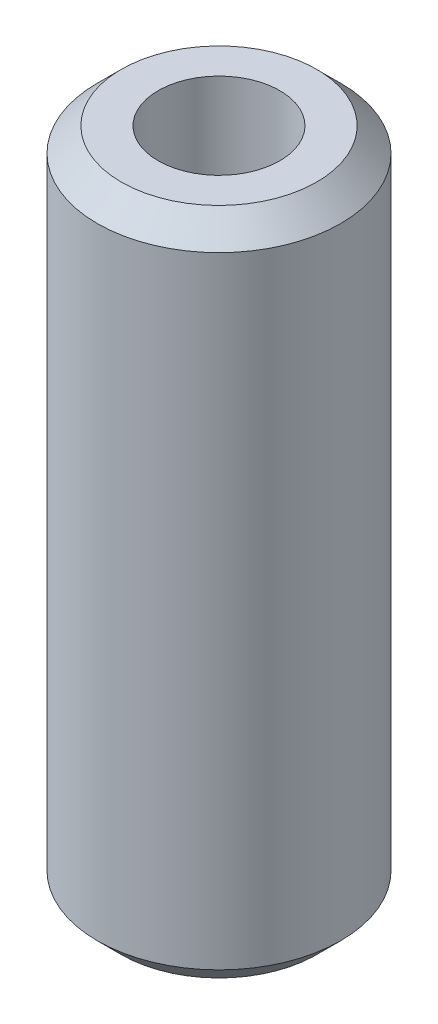
ISO-10303-21;
HEADER;
FILE_DESCRIPTION(('STEP AP214'),'2;1');
FILE_NAME('part.step','',(''),(''),'','','');
FILE_SCHEMA(('AUTOMOTIVE_DESIGN { 1 0 10303 214 1 1 1 1 }'));
ENDSEC;
DATA;
#1=APPLICATION_CONTEXT('core data for automotive mechanical design processes');
#2=APPLICATION_PROTOCOL_DEFINITION('international standard','automotive_design',2000,#1);
#3=PRODUCT_CONTEXT('',#1,'mechanical');
#4=PRODUCT('Part','Part','',(#3));
#5=PRODUCT_RELATED_PRODUCT_CATEGORY('part','',(#4));
#6=PRODUCT_DEFINITION_FORMATION('','',#4);
#7=PRODUCT_DEFINITION_CONTEXT('part definition',#1,'design');
#8=PRODUCT_DEFINITION('design','',#6,#7);
#9=PRODUCT_DEFINITION_SHAPE('','',#8);
#10=(LENGTH_UNIT() NAMED_UNIT(*) SI_UNIT(.MILLI.,.METRE.));
#11=(NAMED_UNIT(*) PLANE_ANGLE_UNIT() SI_UNIT($,.RADIAN.));
#12=(NAMED_UNIT(*) SI_UNIT($,.STERADIAN.) SOLID_ANGLE_UNIT());
#13=UNCERTAINTY_MEASURE_WITH_UNIT(LENGTH_MEASURE(1.E-05),#10,'distance_accuracy_value','');
#14=(GEOMETRIC_REPRESENTATION_CONTEXT(3) GLOBAL_UNCERTAINTY_ASSIGNED_CONTEXT((#13)) GLOBAL_UNIT_ASSIGNED_CONTEXT((#10,
#11,#12)) REPRESENTATION_CONTEXT('',''));
#15=CARTESIAN_POINT('',(0.,0.,0.));
#16=DIRECTION('',(0.,0.,1.));
#17=DIRECTION('',(1.,0.,0.));
#18=AXIS2_PLACEMENT_3D('',#15,#16,#17);
#19=CARTESIAN_POINT('',(0.,69.85,0.));
#20=DIRECTION('',(0.,1.,0.));
#21=DIRECTION('',(0.,0.,1.));
#22=AXIS2_PLACEMENT_3D('',#19,#20,#21);
#23=PLANE('',#22);
#24=CARTESIAN_POINT('',(0.,69.85,0.));
#25=DIRECTION('',(0.,1.,0.));
#26=DIRECTION('',(0.,0.,1.));
#27=AXIS2_PLACEMENT_3D('',#24,#25,#26);
#28=CIRCLE('',#27,10.2);
#29=CARTESIAN_POINT('',(0.,69.85,10.2));
#30=VERTEX_POINT('',#29);
#31=EDGE_CURVE('E10',#30,#30,#28,.T.);
#32=ORIENTED_EDGE('',*,*,#31,.T.);
#33=EDGE_LOOP('',(#32));
#34=FACE_BOUND('',#33,.T.);
#35=CARTESIAN_POINT('',(0.,69.85,0.));
#36=DIRECTION('',(0.,1.,0.));
#37=DIRECTION('',(0.,0.,1.));
#38=AXIS2_PLACEMENT_3D('',#35,#36,#37);
#39=CIRCLE('',#38,6.35);
#40=CARTESIAN_POINT('',(0.,69.85,6.35));
#41=VERTEX_POINT('',#40);
#42=EDGE_CURVE('E64',#41,#41,#39,.T.);
#43=ORIENTED_EDGE('',*,*,#42,.F.);
#44=EDGE_LOOP('',(#43));
#45=FACE_BOUND('',#44,.T.);
#46=ADVANCED_FACE('F39',(#34,#45),#23,.T.);
#47=CARTESIAN_POINT('',(0.,0.,0.));
#48=DIRECTION('',(0.,1.,0.));
#49=DIRECTION('',(0.,0.,1.));
#50=AXIS2_PLACEMENT_3D('',#47,#48,#49);
#51=PLANE('',#50);
#52=CARTESIAN_POINT('',(0.,0.,0.));
#53=DIRECTION('',(0.,1.,0.));
#54=DIRECTION('',(0.,0.,1.));
#55=AXIS2_PLACEMENT_3D('',#52,#53,#54);
#56=CIRCLE('',#55,10.2);
#57=CARTESIAN_POINT('',(0.,0.,10.2));
#58=VERTEX_POINT('',#57);
#59=EDGE_CURVE('E48',#58,#58,#56,.F.);
#60=ORIENTED_EDGE('',*,*,#59,.T.);
#61=EDGE_LOOP('',(#60));
#62=FACE_BOUND('',#61,.T.);
#63=CARTESIAN_POINT('',(0.,0.,0.));
#64=DIRECTION('',(0.,1.,0.));
#65=DIRECTION('',(0.,0.,1.));
#66=AXIS2_PLACEMENT_3D('',#63,#64,#65);
#67=CIRCLE('',#66,6.35);
#68=CARTESIAN_POINT('',(0.,0.,6.35));
#69=VERTEX_POINT('',#68);
#70=EDGE_CURVE('E65',#69,#69,#67,.T.);
#71=ORIENTED_EDGE('',*,*,#70,.T.);
#72=EDGE_LOOP('',(#71));
#73=FACE_BOUND('',#72,.T.);
#74=ADVANCED_FACE('F77',(#62,#73),#51,.F.);
#75=CARTESIAN_POINT('',(0.,69.85,0.));
#76=DIRECTION('',(0.,-1.,0.));
#77=DIRECTION('',(0.,0.,-1.));
#78=AXIS2_PLACEMENT_3D('',#75,#76,#77);
#79=CYLINDRICAL_SURFACE('',#78,12.7);
#80=CARTESIAN_POINT('',(0.,2.5,0.));
#81=DIRECTION('',(0.,1.,0.));
#82=DIRECTION('',(0.,0.,1.));
#83=AXIS2_PLACEMENT_3D('',#80,#81,#82);
#84=CIRCLE('',#83,12.7);
#85=CARTESIAN_POINT('',(0.,2.5,12.7));
#86=VERTEX_POINT('',#85);
#87=EDGE_CURVE('E53',#86,#86,#84,.T.);
#88=ORIENTED_EDGE('',*,*,#87,.T.);
#89=EDGE_LOOP('',(#88));
#90=FACE_BOUND('',#89,.T.);
#91=CARTESIAN_POINT('',(0.,67.35,0.));
#92=DIRECTION('',(0.,1.,0.));
#93=DIRECTION('',(0.,0.,1.));
#94=AXIS2_PLACEMENT_3D('',#91,#92,#93);
#95=CIRCLE('',#94,12.7);
#96=CARTESIAN_POINT('',(0.,67.35,12.7));
#97=VERTEX_POINT('',#96);
#98=EDGE_CURVE('E58',#97,#97,#95,.F.);
#99=ORIENTED_EDGE('',*,*,#98,.T.);
#100=EDGE_LOOP('',(#99));
#101=FACE_BOUND('',#100,.T.);
#102=ADVANCED_FACE('F82',(#90,#101),#79,.T.);
#103=CARTESIAN_POINT('',(0.,69.85,0.));
#104=DIRECTION('',(0.,-1.,0.));
#105=DIRECTION('',(0.,0.,-1.));
#106=AXIS2_PLACEMENT_3D('',#103,#104,#105);
#107=CYLINDRICAL_SURFACE('',#106,6.35);
#108=ORIENTED_EDGE('',*,*,#42,.T.);
#109=EDGE_LOOP('',(#108));
#110=FACE_BOUND('',#109,.T.);
#111=ORIENTED_EDGE('',*,*,#70,.F.);
#112=EDGE_LOOP('',(#111));
#113=FACE_BOUND('',#112,.T.);
#114=ADVANCED_FACE('F73',(#110,#113),#107,.F.);
#115=CARTESIAN_POINT('',(0.,2.5,0.));
#116=DIRECTION('',(0.,1.,0.));
#117=DIRECTION('',(0.,0.,1.));
#118=AXIS2_PLACEMENT_3D('',#115,#116,#117);
#119=CONICAL_SURFACE('',#118,12.7,0.785398163397453);
#120=ORIENTED_EDGE('',*,*,#59,.F.);
#121=EDGE_LOOP('',(#120));
#122=FACE_BOUND('',#121,.T.);
#123=ORIENTED_EDGE('',*,*,#87,.F.);
#124=EDGE_LOOP('',(#123));
#125=FACE_BOUND('',#124,.T.);
#126=ADVANCED_FACE('F89',(#122,#125),#119,.T.);
#127=CARTESIAN_POINT('',(0.,69.85,0.));
#128=DIRECTION('',(0.,-1.,0.));
#129=DIRECTION('',(0.,0.,-1.));
#130=AXIS2_PLACEMENT_3D('',#127,#128,#129);
#131=CONICAL_SURFACE('',#130,10.2,0.785398163397448);
#132=ORIENTED_EDGE('',*,*,#98,.F.);
#133=EDGE_LOOP('',(#132));
#134=FACE_BOUND('',#133,.T.);
#135=ORIENTED_EDGE('',*,*,#31,.F.);
#136=EDGE_LOOP('',(#135));
#137=FACE_BOUND('',#136,.T.);
#138=ADVANCED_FACE('F42',(#134,#137),#131,.T.);
#139=CLOSED_SHELL('',(#46,#74,#102,#114,#126,#138));
#140=MANIFOLD_SOLID_BREP('B2',#139);
#141=ADVANCED_BREP_SHAPE_REPRESENTATION('',(#18,#140),#14);
#142=SHAPE_DEFINITION_REPRESENTATION(#9,#141);
ENDSEC;
END-ISO-10303-21;
